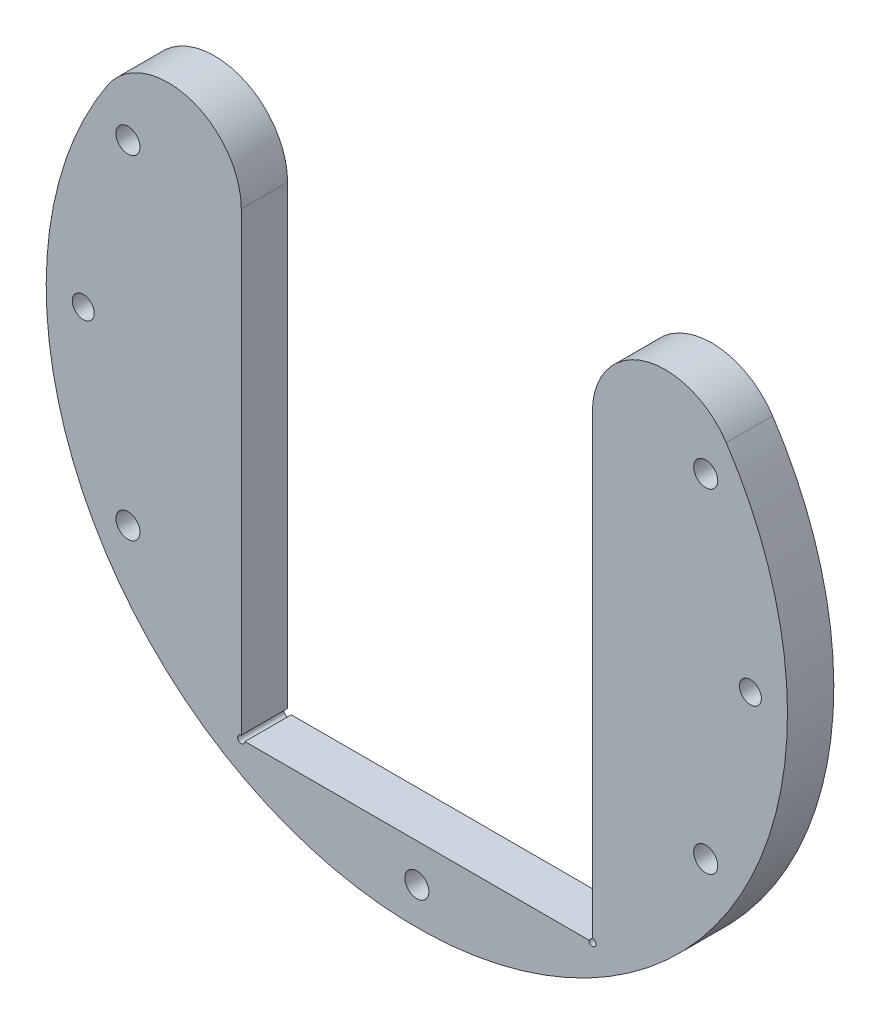
ISO-10303-21;
HEADER;
FILE_DESCRIPTION(('STEP AP214'),'2;1');
FILE_NAME('part.step','',(''),(''),'','','');
FILE_SCHEMA(('AUTOMOTIVE_DESIGN { 1 0 10303 214 1 1 1 1 }'));
ENDSEC;
DATA;
#1=APPLICATION_CONTEXT('core data for automotive mechanical design processes');
#2=APPLICATION_PROTOCOL_DEFINITION('international standard','automotive_design',2000,#1);
#3=PRODUCT_CONTEXT('',#1,'mechanical');
#4=PRODUCT('Part','Part','',(#3));
#5=PRODUCT_RELATED_PRODUCT_CATEGORY('part','',(#4));
#6=PRODUCT_DEFINITION_FORMATION('','',#4);
#7=PRODUCT_DEFINITION_CONTEXT('part definition',#1,'design');
#8=PRODUCT_DEFINITION('design','',#6,#7);
#9=PRODUCT_DEFINITION_SHAPE('','',#8);
#10=(LENGTH_UNIT() NAMED_UNIT(*) SI_UNIT(.MILLI.,.METRE.));
#11=(NAMED_UNIT(*) PLANE_ANGLE_UNIT() SI_UNIT($,.RADIAN.));
#12=(NAMED_UNIT(*) SI_UNIT($,.STERADIAN.) SOLID_ANGLE_UNIT());
#13=UNCERTAINTY_MEASURE_WITH_UNIT(LENGTH_MEASURE(1.E-05),#10,'distance_accuracy_value','');
#14=(GEOMETRIC_REPRESENTATION_CONTEXT(3) GLOBAL_UNCERTAINTY_ASSIGNED_CONTEXT((#13)) GLOBAL_UNIT_ASSIGNED_CONTEXT((#10,
#11,#12)) REPRESENTATION_CONTEXT('',''));
#15=CARTESIAN_POINT('',(0.,0.,0.));
#16=DIRECTION('',(0.,0.,1.));
#17=DIRECTION('',(1.,0.,0.));
#18=AXIS2_PLACEMENT_3D('',#15,#16,#17);
#19=CARTESIAN_POINT('',(-24.062500008,0.,6.35));
#20=DIRECTION('',(-1.,0.,0.));
#21=DIRECTION('',(0.,0.,1.));
#22=AXIS2_PLACEMENT_3D('',#19,#20,#21);
#23=PLANE('',#22);
#24=DIRECTION('',(0.,1.,0.));
#25=VECTOR('',#24,1.);
#26=CARTESIAN_POINT('',(-24.062500008,0.,6.35));
#27=LINE('',#26,#25);
#28=CARTESIAN_POINT('',(-24.062500008,-40.,6.35));
#29=VERTEX_POINT('',#28);
#30=CARTESIAN_POINT('',(-24.062500008,22.4585416535669,6.35));
#31=VERTEX_POINT('',#30);
#32=EDGE_CURVE('E149',#29,#31,#27,.T.);
#33=ORIENTED_EDGE('',*,*,#32,.F.);
#34=DIRECTION('',(0.,0.,1.));
#35=VECTOR('',#34,1.);
#36=CARTESIAN_POINT('',(-24.062500008,-40.,0.));
#37=LINE('',#36,#35);
#38=CARTESIAN_POINT('',(-24.062500008,-40.,0.));
#39=VERTEX_POINT('',#38);
#40=EDGE_CURVE('E178',#29,#39,#37,.F.);
#41=ORIENTED_EDGE('',*,*,#40,.T.);
#42=DIRECTION('',(0.,1.,0.));
#43=VECTOR('',#42,1.);
#44=CARTESIAN_POINT('',(-24.062500008,0.,0.));
#45=LINE('',#44,#43);
#46=CARTESIAN_POINT('',(-24.062500008,22.4585416535669,0.));
#47=VERTEX_POINT('',#46);
#48=EDGE_CURVE('E150',#39,#47,#45,.T.);
#49=ORIENTED_EDGE('',*,*,#48,.T.);
#50=DIRECTION('',(0.,0.,-1.));
#51=VECTOR('',#50,1.);
#52=CARTESIAN_POINT('',(-24.062500008,22.4585416535669,6.35));
#53=LINE('',#52,#51);
#54=EDGE_CURVE('E142',#47,#31,#53,.F.);
#55=ORIENTED_EDGE('',*,*,#54,.T.);
#56=EDGE_LOOP('',(#33,#41,#49,#55));
#57=FACE_BOUND('',#56,.T.);
#58=ADVANCED_FACE('F35',(#57),#23,.F.);
#59=CARTESIAN_POINT('',(0.,0.,6.35));
#60=DIRECTION('',(0.,0.,-1.));
#61=DIRECTION('',(-1.,0.,0.));
#62=AXIS2_PLACEMENT_3D('',#59,#60,#61);
#63=CYLINDRICAL_SURFACE('',#62,50.8);
#64=CARTESIAN_POINT('',(0.,0.,0.));
#65=DIRECTION('',(0.,0.,1.));
#66=DIRECTION('',(1.,0.,0.));
#67=AXIS2_PLACEMENT_3D('',#64,#65,#66);
#68=CIRCLE('',#67,50.8);
#69=CARTESIAN_POINT('',(-42.4111519707451,27.9630861765,0.));
#70=VERTEX_POINT('',#69);
#71=CARTESIAN_POINT('',(42.4111519707451,27.9630861765,0.));
#72=VERTEX_POINT('',#71);
#73=EDGE_CURVE('E120',#70,#72,#68,.T.);
#74=ORIENTED_EDGE('',*,*,#73,.T.);
#75=DIRECTION('',(0.,0.,-1.));
#76=VECTOR('',#75,1.);
#77=CARTESIAN_POINT('',(42.4111519707451,27.9630861765,6.35));
#78=LINE('',#77,#76);
#79=CARTESIAN_POINT('',(42.4111519707451,27.9630861765,6.35));
#80=VERTEX_POINT('',#79);
#81=EDGE_CURVE('E135',#72,#80,#78,.F.);
#82=ORIENTED_EDGE('',*,*,#81,.T.);
#83=CARTESIAN_POINT('',(0.,0.,6.35));
#84=DIRECTION('',(0.,0.,1.));
#85=DIRECTION('',(1.,0.,0.));
#86=AXIS2_PLACEMENT_3D('',#83,#84,#85);
#87=CIRCLE('',#86,50.8);
#88=CARTESIAN_POINT('',(-42.4111519707451,27.9630861765,6.35));
#89=VERTEX_POINT('',#88);
#90=EDGE_CURVE('E158',#89,#80,#87,.T.);
#91=ORIENTED_EDGE('',*,*,#90,.F.);
#92=DIRECTION('',(0.,0.,-1.));
#93=VECTOR('',#92,1.);
#94=CARTESIAN_POINT('',(-42.4111519707451,27.9630861765,6.35));
#95=LINE('',#94,#93);
#96=EDGE_CURVE('E132',#89,#70,#95,.T.);
#97=ORIENTED_EDGE('',*,*,#96,.T.);
#98=EDGE_LOOP('',(#74,#82,#91,#97));
#99=FACE_BOUND('',#98,.T.);
#100=ADVANCED_FACE('F163',(#99),#63,.T.);
#101=CARTESIAN_POINT('',(24.062500008,0.,6.35));
#102=DIRECTION('',(-1.,0.,0.));
#103=DIRECTION('',(0.,0.,1.));
#104=AXIS2_PLACEMENT_3D('',#101,#102,#103);
#105=PLANE('',#104);
#106=DIRECTION('',(0.,0.,1.));
#107=VECTOR('',#106,1.);
#108=CARTESIAN_POINT('',(24.062500008,-40.,0.));
#109=LINE('',#108,#107);
#110=CARTESIAN_POINT('',(24.062500008,-40.,6.35));
#111=VERTEX_POINT('',#110);
#112=CARTESIAN_POINT('',(24.062500008,-40.,0.));
#113=VERTEX_POINT('',#112);
#114=EDGE_CURVE('E50',#111,#113,#109,.F.);
#115=ORIENTED_EDGE('',*,*,#114,.F.);
#116=DIRECTION('',(0.,1.,0.));
#117=VECTOR('',#116,1.);
#118=CARTESIAN_POINT('',(24.062500008,0.,6.35));
#119=LINE('',#118,#117);
#120=CARTESIAN_POINT('',(24.062500008,22.4585416535669,6.35));
#121=VERTEX_POINT('',#120);
#122=EDGE_CURVE('E166',#111,#121,#119,.T.);
#123=ORIENTED_EDGE('',*,*,#122,.T.);
#124=DIRECTION('',(0.,0.,1.));
#125=VECTOR('',#124,1.);
#126=CARTESIAN_POINT('',(24.062500008,22.4585416535669,0.));
#127=LINE('',#126,#125);
#128=CARTESIAN_POINT('',(24.062500008,22.4585416535669,0.));
#129=VERTEX_POINT('',#128);
#130=EDGE_CURVE('E124',#121,#129,#127,.F.);
#131=ORIENTED_EDGE('',*,*,#130,.T.);
#132=DIRECTION('',(0.,1.,0.));
#133=VECTOR('',#132,1.);
#134=CARTESIAN_POINT('',(24.062500008,0.,0.));
#135=LINE('',#134,#133);
#136=EDGE_CURVE('E115',#113,#129,#135,.T.);
#137=ORIENTED_EDGE('',*,*,#136,.F.);
#138=EDGE_LOOP('',(#115,#123,#131,#137));
#139=FACE_BOUND('',#138,.T.);
#140=ADVANCED_FACE('F202',(#139),#105,.T.);
#141=CARTESIAN_POINT('',(-45.72,0.,6.35));
#142=DIRECTION('',(0.,0.,-1.));
#143=DIRECTION('',(-1.,0.,0.));
#144=AXIS2_PLACEMENT_3D('',#141,#142,#143);
#145=CYLINDRICAL_SURFACE('',#144,1.5);
#146=CARTESIAN_POINT('',(-45.72,0.,6.35));
#147=DIRECTION('',(0.,0.,1.));
#148=DIRECTION('',(1.,0.,0.));
#149=AXIS2_PLACEMENT_3D('',#146,#147,#148);
#150=CIRCLE('',#149,1.5);
#151=CARTESIAN_POINT('',(-44.22,0.,6.35));
#152=VERTEX_POINT('',#151);
#153=EDGE_CURVE('E169',#152,#152,#150,.T.);
#154=ORIENTED_EDGE('',*,*,#153,.T.);
#155=EDGE_LOOP('',(#154));
#156=FACE_BOUND('',#155,.T.);
#157=CARTESIAN_POINT('',(-45.72,0.,0.));
#158=DIRECTION('',(0.,0.,1.));
#159=DIRECTION('',(1.,0.,0.));
#160=AXIS2_PLACEMENT_3D('',#157,#158,#159);
#161=CIRCLE('',#160,1.5);
#162=CARTESIAN_POINT('',(-44.22,0.,0.));
#163=VERTEX_POINT('',#162);
#164=EDGE_CURVE('E193',#163,#163,#161,.T.);
#165=ORIENTED_EDGE('',*,*,#164,.F.);
#166=EDGE_LOOP('',(#165));
#167=FACE_BOUND('',#166,.T.);
#168=ADVANCED_FACE('F226',(#156,#167),#145,.F.);
#169=CARTESIAN_POINT('',(45.72,0.,6.35));
#170=DIRECTION('',(0.,0.,-1.));
#171=DIRECTION('',(-1.,0.,0.));
#172=AXIS2_PLACEMENT_3D('',#169,#170,#171);
#173=CYLINDRICAL_SURFACE('',#172,1.5);
#174=CARTESIAN_POINT('',(45.72,0.,6.35));
#175=DIRECTION('',(0.,0.,1.));
#176=DIRECTION('',(1.,0.,0.));
#177=AXIS2_PLACEMENT_3D('',#174,#175,#176);
#178=CIRCLE('',#177,1.5);
#179=CARTESIAN_POINT('',(47.22,0.,6.35));
#180=VERTEX_POINT('',#179);
#181=EDGE_CURVE('E221',#180,#180,#178,.T.);
#182=ORIENTED_EDGE('',*,*,#181,.T.);
#183=EDGE_LOOP('',(#182));
#184=FACE_BOUND('',#183,.T.);
#185=CARTESIAN_POINT('',(45.72,0.,0.));
#186=DIRECTION('',(0.,0.,1.));
#187=DIRECTION('',(1.,0.,0.));
#188=AXIS2_PLACEMENT_3D('',#185,#186,#187);
#189=CIRCLE('',#188,1.5);
#190=CARTESIAN_POINT('',(47.22,0.,0.));
#191=VERTEX_POINT('',#190);
#192=EDGE_CURVE('E190',#191,#191,#189,.T.);
#193=ORIENTED_EDGE('',*,*,#192,.F.);
#194=EDGE_LOOP('',(#193));
#195=FACE_BOUND('',#194,.T.);
#196=ADVANCED_FACE('F252',(#184,#195),#173,.F.);
#197=CARTESIAN_POINT('',(-39.5946814610245,22.86,6.35));
#198=DIRECTION('',(0.,0.,-1.));
#199=DIRECTION('',(-1.,0.,0.));
#200=AXIS2_PLACEMENT_3D('',#197,#198,#199);
#201=CYLINDRICAL_SURFACE('',#200,1.65);
#202=CARTESIAN_POINT('',(-39.5946814610245,22.86,6.35));
#203=DIRECTION('',(0.,0.,1.));
#204=DIRECTION('',(1.,0.,0.));
#205=AXIS2_PLACEMENT_3D('',#202,#203,#204);
#206=CIRCLE('',#205,1.65);
#207=CARTESIAN_POINT('',(-37.9446814610246,22.86,6.35));
#208=VERTEX_POINT('',#207);
#209=EDGE_CURVE('E218',#208,#208,#206,.T.);
#210=ORIENTED_EDGE('',*,*,#209,.T.);
#211=EDGE_LOOP('',(#210));
#212=FACE_BOUND('',#211,.T.);
#213=CARTESIAN_POINT('',(-39.5946814610245,22.86,0.));
#214=DIRECTION('',(0.,0.,1.));
#215=DIRECTION('',(1.,0.,0.));
#216=AXIS2_PLACEMENT_3D('',#213,#214,#215);
#217=CIRCLE('',#216,1.65);
#218=CARTESIAN_POINT('',(-37.9446814610246,22.86,0.));
#219=VERTEX_POINT('',#218);
#220=EDGE_CURVE('E187',#219,#219,#217,.T.);
#221=ORIENTED_EDGE('',*,*,#220,.F.);
#222=EDGE_LOOP('',(#221));
#223=FACE_BOUND('',#222,.T.);
#224=ADVANCED_FACE('F255',(#212,#223),#201,.F.);
#225=CARTESIAN_POINT('',(39.5946814610245,22.86,6.35));
#226=DIRECTION('',(0.,0.,-1.));
#227=DIRECTION('',(-1.,0.,0.));
#228=AXIS2_PLACEMENT_3D('',#225,#226,#227);
#229=CYLINDRICAL_SURFACE('',#228,1.65);
#230=CARTESIAN_POINT('',(39.5946814610245,22.86,6.35));
#231=DIRECTION('',(0.,0.,1.));
#232=DIRECTION('',(1.,0.,0.));
#233=AXIS2_PLACEMENT_3D('',#230,#231,#232);
#234=CIRCLE('',#233,1.65);
#235=CARTESIAN_POINT('',(41.2446814610245,22.86,6.35));
#236=VERTEX_POINT('',#235);
#237=EDGE_CURVE('E215',#236,#236,#234,.T.);
#238=ORIENTED_EDGE('',*,*,#237,.T.);
#239=EDGE_LOOP('',(#238));
#240=FACE_BOUND('',#239,.T.);
#241=CARTESIAN_POINT('',(39.5946814610245,22.86,0.));
#242=DIRECTION('',(0.,0.,1.));
#243=DIRECTION('',(1.,0.,0.));
#244=AXIS2_PLACEMENT_3D('',#241,#242,#243);
#245=CIRCLE('',#244,1.65);
#246=CARTESIAN_POINT('',(41.2446814610245,22.86,0.));
#247=VERTEX_POINT('',#246);
#248=EDGE_CURVE('E184',#247,#247,#245,.T.);
#249=ORIENTED_EDGE('',*,*,#248,.F.);
#250=EDGE_LOOP('',(#249));
#251=FACE_BOUND('',#250,.T.);
#252=ADVANCED_FACE('F259',(#240,#251),#229,.F.);
#253=CARTESIAN_POINT('',(39.5946814610245,-22.86,6.35));
#254=DIRECTION('',(0.,0.,-1.));
#255=DIRECTION('',(-1.,0.,0.));
#256=AXIS2_PLACEMENT_3D('',#253,#254,#255);
#257=CYLINDRICAL_SURFACE('',#256,1.65);
#258=CARTESIAN_POINT('',(39.5946814610245,-22.86,6.35));
#259=DIRECTION('',(0.,0.,1.));
#260=DIRECTION('',(1.,0.,0.));
#261=AXIS2_PLACEMENT_3D('',#258,#259,#260);
#262=CIRCLE('',#261,1.65);
#263=CARTESIAN_POINT('',(41.2446814610245,-22.86,6.35));
#264=VERTEX_POINT('',#263);
#265=EDGE_CURVE('E212',#264,#264,#262,.T.);
#266=ORIENTED_EDGE('',*,*,#265,.T.);
#267=EDGE_LOOP('',(#266));
#268=FACE_BOUND('',#267,.T.);
#269=CARTESIAN_POINT('',(39.5946814610245,-22.86,0.));
#270=DIRECTION('',(0.,0.,1.));
#271=DIRECTION('',(1.,0.,0.));
#272=AXIS2_PLACEMENT_3D('',#269,#270,#271);
#273=CIRCLE('',#272,1.65);
#274=CARTESIAN_POINT('',(41.2446814610245,-22.86,0.));
#275=VERTEX_POINT('',#274);
#276=EDGE_CURVE('E181',#275,#275,#273,.T.);
#277=ORIENTED_EDGE('',*,*,#276,.F.);
#278=EDGE_LOOP('',(#277));
#279=FACE_BOUND('',#278,.T.);
#280=ADVANCED_FACE('F263',(#268,#279),#257,.F.);
#281=CARTESIAN_POINT('',(0.,-45.72,6.35));
#282=DIRECTION('',(0.,0.,-1.));
#283=DIRECTION('',(-1.,0.,0.));
#284=AXIS2_PLACEMENT_3D('',#281,#282,#283);
#285=CYLINDRICAL_SURFACE('',#284,1.65);
#286=CARTESIAN_POINT('',(0.,-45.72,6.35));
#287=DIRECTION('',(0.,0.,1.));
#288=DIRECTION('',(1.,0.,0.));
#289=AXIS2_PLACEMENT_3D('',#286,#287,#288);
#290=CIRCLE('',#289,1.65);
#291=CARTESIAN_POINT('',(1.65000000000001,-45.72,6.35));
#292=VERTEX_POINT('',#291);
#293=EDGE_CURVE('E118',#292,#292,#290,.T.);
#294=ORIENTED_EDGE('',*,*,#293,.T.);
#295=EDGE_LOOP('',(#294));
#296=FACE_BOUND('',#295,.T.);
#297=CARTESIAN_POINT('',(0.,-45.72,0.));
#298=DIRECTION('',(0.,0.,1.));
#299=DIRECTION('',(1.,0.,0.));
#300=AXIS2_PLACEMENT_3D('',#297,#298,#299);
#301=CIRCLE('',#300,1.65);
#302=CARTESIAN_POINT('',(1.65000000000001,-45.72,0.));
#303=VERTEX_POINT('',#302);
#304=EDGE_CURVE('E177',#303,#303,#301,.T.);
#305=ORIENTED_EDGE('',*,*,#304,.F.);
#306=EDGE_LOOP('',(#305));
#307=FACE_BOUND('',#306,.T.);
#308=ADVANCED_FACE('F267',(#296,#307),#285,.F.);
#309=CARTESIAN_POINT('',(-39.5946814610245,-22.86,6.35));
#310=DIRECTION('',(0.,0.,-1.));
#311=DIRECTION('',(-1.,0.,0.));
#312=AXIS2_PLACEMENT_3D('',#309,#310,#311);
#313=CYLINDRICAL_SURFACE('',#312,1.65);
#314=CARTESIAN_POINT('',(-39.5946814610245,-22.86,6.35));
#315=DIRECTION('',(0.,0.,1.));
#316=DIRECTION('',(1.,0.,0.));
#317=AXIS2_PLACEMENT_3D('',#314,#315,#316);
#318=CIRCLE('',#317,1.65);
#319=CARTESIAN_POINT('',(-37.9446814610245,-22.86,6.35));
#320=VERTEX_POINT('',#319);
#321=EDGE_CURVE('E114',#320,#320,#318,.T.);
#322=ORIENTED_EDGE('',*,*,#321,.T.);
#323=EDGE_LOOP('',(#322));
#324=FACE_BOUND('',#323,.T.);
#325=CARTESIAN_POINT('',(-39.5946814610245,-22.86,0.));
#326=DIRECTION('',(0.,0.,1.));
#327=DIRECTION('',(1.,0.,0.));
#328=AXIS2_PLACEMENT_3D('',#325,#326,#327);
#329=CIRCLE('',#328,1.65);
#330=CARTESIAN_POINT('',(-37.9446814610245,-22.86,0.));
#331=VERTEX_POINT('',#330);
#332=EDGE_CURVE('E174',#331,#331,#329,.T.);
#333=ORIENTED_EDGE('',*,*,#332,.F.);
#334=EDGE_LOOP('',(#333));
#335=FACE_BOUND('',#334,.T.);
#336=ADVANCED_FACE('F237',(#324,#335),#313,.F.);
#337=CARTESIAN_POINT('',(0.,-40.5,6.35));
#338=DIRECTION('',(0.,1.,0.));
#339=DIRECTION('',(-1.,0.,0.));
#340=AXIS2_PLACEMENT_3D('',#337,#338,#339);
#341=PLANE('',#340);
#342=DIRECTION('',(0.,0.,1.));
#343=VECTOR('',#342,1.);
#344=CARTESIAN_POINT('',(23.562500008,-40.5,0.));
#345=LINE('',#344,#343);
#346=CARTESIAN_POINT('',(23.562500008,-40.5,0.));
#347=VERTEX_POINT('',#346);
#348=CARTESIAN_POINT('',(23.562500008,-40.5,6.35));
#349=VERTEX_POINT('',#348);
#350=EDGE_CURVE('E98',#347,#349,#345,.T.);
#351=ORIENTED_EDGE('',*,*,#350,.F.);
#352=DIRECTION('',(1.,0.,0.));
#353=VECTOR('',#352,1.);
#354=CARTESIAN_POINT('',(0.,-40.5,0.));
#355=LINE('',#354,#353);
#356=CARTESIAN_POINT('',(-23.562500008,-40.5,0.));
#357=VERTEX_POINT('',#356);
#358=EDGE_CURVE('E107',#357,#347,#355,.T.);
#359=ORIENTED_EDGE('',*,*,#358,.F.);
#360=DIRECTION('',(0.,0.,1.));
#361=VECTOR('',#360,1.);
#362=CARTESIAN_POINT('',(-23.562500008,-40.5,0.));
#363=LINE('',#362,#361);
#364=CARTESIAN_POINT('',(-23.562500008,-40.5,6.35));
#365=VERTEX_POINT('',#364);
#366=EDGE_CURVE('E57',#365,#357,#363,.F.);
#367=ORIENTED_EDGE('',*,*,#366,.F.);
#368=DIRECTION('',(1.,0.,0.));
#369=VECTOR('',#368,1.);
#370=CARTESIAN_POINT('',(0.,-40.5,6.35));
#371=LINE('',#370,#369);
#372=EDGE_CURVE('E109',#365,#349,#371,.T.);
#373=ORIENTED_EDGE('',*,*,#372,.T.);
#374=EDGE_LOOP('',(#351,#359,#367,#373));
#375=FACE_BOUND('',#374,.T.);
#376=ADVANCED_FACE('F106',(#375),#341,.T.);
#377=CARTESIAN_POINT('',(0.,0.,6.35));
#378=DIRECTION('',(0.,0.,1.));
#379=DIRECTION('',(1.,0.,0.));
#380=AXIS2_PLACEMENT_3D('',#377,#378,#379);
#381=PLANE('',#380);
#382=CARTESIAN_POINT('',(24.062500008,-40.5,6.35));
#383=DIRECTION('',(0.,0.,1.));
#384=DIRECTION('',(1.,0.,0.));
#385=AXIS2_PLACEMENT_3D('',#382,#383,#384);
#386=CIRCLE('',#385,0.499999999999999);
#387=EDGE_CURVE('E110',#349,#111,#386,.T.);
#388=ORIENTED_EDGE('',*,*,#387,.F.);
#389=ORIENTED_EDGE('',*,*,#372,.F.);
#390=CARTESIAN_POINT('',(-24.062500008,-40.5,6.35));
#391=DIRECTION('',(0.,0.,1.));
#392=DIRECTION('',(1.,0.,0.));
#393=AXIS2_PLACEMENT_3D('',#390,#391,#392);
#394=CIRCLE('',#393,0.499999999999999);
#395=EDGE_CURVE('E203',#29,#365,#394,.T.);
#396=ORIENTED_EDGE('',*,*,#395,.F.);
#397=ORIENTED_EDGE('',*,*,#32,.T.);
#398=CARTESIAN_POINT('',(-34.062500008,22.4585416535669,6.35));
#399=DIRECTION('',(0.,0.,1.));
#400=DIRECTION('',(1.,0.,0.));
#401=AXIS2_PLACEMENT_3D('',#398,#399,#400);
#402=CIRCLE('',#401,10.);
#403=EDGE_CURVE('E137',#31,#89,#402,.T.);
#404=ORIENTED_EDGE('',*,*,#403,.T.);
#405=ORIENTED_EDGE('',*,*,#90,.T.);
#406=CARTESIAN_POINT('',(34.062500008,22.4585416535669,6.35));
#407=DIRECTION('',(0.,0.,1.));
#408=DIRECTION('',(1.,0.,0.));
#409=AXIS2_PLACEMENT_3D('',#406,#407,#408);
#410=CIRCLE('',#409,10.);
#411=EDGE_CURVE('E139',#80,#121,#410,.T.);
#412=ORIENTED_EDGE('',*,*,#411,.T.);
#413=ORIENTED_EDGE('',*,*,#122,.F.);
#414=EDGE_LOOP('',(#388,#389,#396,#397,#404,#405,#412,#413));
#415=FACE_BOUND('',#414,.T.);
#416=ORIENTED_EDGE('',*,*,#321,.F.);
#417=EDGE_LOOP('',(#416));
#418=FACE_BOUND('',#417,.T.);
#419=ORIENTED_EDGE('',*,*,#293,.F.);
#420=EDGE_LOOP('',(#419));
#421=FACE_BOUND('',#420,.T.);
#422=ORIENTED_EDGE('',*,*,#265,.F.);
#423=EDGE_LOOP('',(#422));
#424=FACE_BOUND('',#423,.T.);
#425=ORIENTED_EDGE('',*,*,#237,.F.);
#426=EDGE_LOOP('',(#425));
#427=FACE_BOUND('',#426,.T.);
#428=ORIENTED_EDGE('',*,*,#209,.F.);
#429=EDGE_LOOP('',(#428));
#430=FACE_BOUND('',#429,.T.);
#431=ORIENTED_EDGE('',*,*,#181,.F.);
#432=EDGE_LOOP('',(#431));
#433=FACE_BOUND('',#432,.T.);
#434=ORIENTED_EDGE('',*,*,#153,.F.);
#435=EDGE_LOOP('',(#434));
#436=FACE_BOUND('',#435,.T.);
#437=ADVANCED_FACE('F156',(#415,#418,#421,#424,#427,#430,#433,#436),#381,.T.);
#438=CARTESIAN_POINT('',(0.,0.,0.));
#439=DIRECTION('',(0.,0.,1.));
#440=DIRECTION('',(1.,0.,0.));
#441=AXIS2_PLACEMENT_3D('',#438,#439,#440);
#442=PLANE('',#441);
#443=ORIENTED_EDGE('',*,*,#332,.T.);
#444=EDGE_LOOP('',(#443));
#445=FACE_BOUND('',#444,.T.);
#446=ORIENTED_EDGE('',*,*,#304,.T.);
#447=EDGE_LOOP('',(#446));
#448=FACE_BOUND('',#447,.T.);
#449=ORIENTED_EDGE('',*,*,#276,.T.);
#450=EDGE_LOOP('',(#449));
#451=FACE_BOUND('',#450,.T.);
#452=ORIENTED_EDGE('',*,*,#248,.T.);
#453=EDGE_LOOP('',(#452));
#454=FACE_BOUND('',#453,.T.);
#455=ORIENTED_EDGE('',*,*,#220,.T.);
#456=EDGE_LOOP('',(#455));
#457=FACE_BOUND('',#456,.T.);
#458=ORIENTED_EDGE('',*,*,#192,.T.);
#459=EDGE_LOOP('',(#458));
#460=FACE_BOUND('',#459,.T.);
#461=ORIENTED_EDGE('',*,*,#164,.T.);
#462=EDGE_LOOP('',(#461));
#463=FACE_BOUND('',#462,.T.);
#464=ORIENTED_EDGE('',*,*,#358,.T.);
#465=CARTESIAN_POINT('',(24.062500008,-40.5,0.));
#466=DIRECTION('',(0.,0.,1.));
#467=DIRECTION('',(1.,0.,0.));
#468=AXIS2_PLACEMENT_3D('',#465,#466,#467);
#469=CIRCLE('',#468,0.499999999999999);
#470=EDGE_CURVE('E11',#347,#113,#469,.T.);
#471=ORIENTED_EDGE('',*,*,#470,.T.);
#472=ORIENTED_EDGE('',*,*,#136,.T.);
#473=CARTESIAN_POINT('',(34.062500008,22.4585416535669,0.));
#474=DIRECTION('',(0.,0.,1.));
#475=DIRECTION('',(1.,0.,0.));
#476=AXIS2_PLACEMENT_3D('',#473,#474,#475);
#477=CIRCLE('',#476,10.);
#478=EDGE_CURVE('E130',#129,#72,#477,.F.);
#479=ORIENTED_EDGE('',*,*,#478,.T.);
#480=ORIENTED_EDGE('',*,*,#73,.F.);
#481=CARTESIAN_POINT('',(-34.062500008,22.4585416535669,0.));
#482=DIRECTION('',(0.,0.,1.));
#483=DIRECTION('',(1.,0.,0.));
#484=AXIS2_PLACEMENT_3D('',#481,#482,#483);
#485=CIRCLE('',#484,10.);
#486=EDGE_CURVE('E127',#70,#47,#485,.F.);
#487=ORIENTED_EDGE('',*,*,#486,.T.);
#488=ORIENTED_EDGE('',*,*,#48,.F.);
#489=CARTESIAN_POINT('',(-24.062500008,-40.5,0.));
#490=DIRECTION('',(0.,0.,1.));
#491=DIRECTION('',(1.,0.,0.));
#492=AXIS2_PLACEMENT_3D('',#489,#490,#491);
#493=CIRCLE('',#492,0.499999999999999);
#494=EDGE_CURVE('E43',#39,#357,#493,.T.);
#495=ORIENTED_EDGE('',*,*,#494,.T.);
#496=EDGE_LOOP('',(#464,#471,#472,#479,#480,#487,#488,#495));
#497=FACE_BOUND('',#496,.T.);
#498=ADVANCED_FACE('F112',(#445,#448,#451,#454,#457,#460,#463,#497),#442,.F.);
#499=CARTESIAN_POINT('',(34.062500008,22.4585416535669,6.35));
#500=DIRECTION('',(0.,0.,-1.));
#501=DIRECTION('',(-1.,0.,0.));
#502=AXIS2_PLACEMENT_3D('',#499,#500,#501);
#503=CYLINDRICAL_SURFACE('',#502,10.);
#504=ORIENTED_EDGE('',*,*,#411,.F.);
#505=ORIENTED_EDGE('',*,*,#81,.F.);
#506=ORIENTED_EDGE('',*,*,#478,.F.);
#507=ORIENTED_EDGE('',*,*,#130,.F.);
#508=EDGE_LOOP('',(#504,#505,#506,#507));
#509=FACE_BOUND('',#508,.T.);
#510=ADVANCED_FACE('F198',(#509),#503,.T.);
#511=CARTESIAN_POINT('',(-34.062500008,22.4585416535669,6.35));
#512=DIRECTION('',(0.,0.,-1.));
#513=DIRECTION('',(-1.,0.,0.));
#514=AXIS2_PLACEMENT_3D('',#511,#512,#513);
#515=CYLINDRICAL_SURFACE('',#514,10.);
#516=ORIENTED_EDGE('',*,*,#403,.F.);
#517=ORIENTED_EDGE('',*,*,#54,.F.);
#518=ORIENTED_EDGE('',*,*,#486,.F.);
#519=ORIENTED_EDGE('',*,*,#96,.F.);
#520=EDGE_LOOP('',(#516,#517,#518,#519));
#521=FACE_BOUND('',#520,.T.);
#522=ADVANCED_FACE('F37',(#521),#515,.T.);
#523=CARTESIAN_POINT('',(-24.062500008,-40.5,0.));
#524=DIRECTION('',(0.,0.,1.));
#525=DIRECTION('',(1.,0.,0.));
#526=AXIS2_PLACEMENT_3D('',#523,#524,#525);
#527=CYLINDRICAL_SURFACE('',#526,0.499999999999999);
#528=ORIENTED_EDGE('',*,*,#395,.T.);
#529=ORIENTED_EDGE('',*,*,#366,.T.);
#530=ORIENTED_EDGE('',*,*,#494,.F.);
#531=ORIENTED_EDGE('',*,*,#40,.F.);
#532=EDGE_LOOP('',(#528,#529,#530,#531));
#533=FACE_BOUND('',#532,.T.);
#534=ADVANCED_FACE('F279',(#533),#527,.F.);
#535=CARTESIAN_POINT('',(24.062500008,-40.5,0.));
#536=DIRECTION('',(0.,0.,1.));
#537=DIRECTION('',(1.,0.,0.));
#538=AXIS2_PLACEMENT_3D('',#535,#536,#537);
#539=CYLINDRICAL_SURFACE('',#538,0.499999999999999);
#540=ORIENTED_EDGE('',*,*,#114,.T.);
#541=ORIENTED_EDGE('',*,*,#470,.F.);
#542=ORIENTED_EDGE('',*,*,#350,.T.);
#543=ORIENTED_EDGE('',*,*,#387,.T.);
#544=EDGE_LOOP('',(#540,#541,#542,#543));
#545=FACE_BOUND('',#544,.T.);
#546=ADVANCED_FACE('F97',(#545),#539,.F.);
#547=CLOSED_SHELL('',(#58,#100,#140,#168,#196,#224,#252,#280,#308,#336,#376,#437,#498,#510,#522,
#534,#546));
#548=MANIFOLD_SOLID_BREP('B2',#547);
#549=ADVANCED_BREP_SHAPE_REPRESENTATION('',(#18,#548),#14);
#550=SHAPE_DEFINITION_REPRESENTATION(#9,#549);
ENDSEC;
END-ISO-10303-21;
